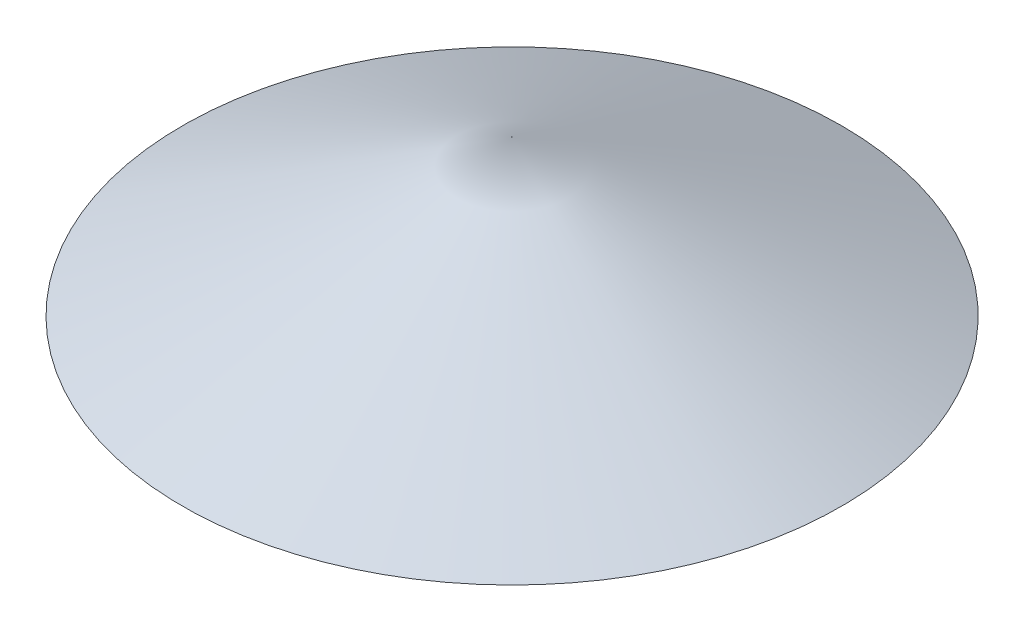
ISO-10303-21;
HEADER;
FILE_DESCRIPTION(('STEP AP214'),'2;1');
FILE_NAME('part.step','',(''),(''),'','','');
FILE_SCHEMA(('AUTOMOTIVE_DESIGN { 1 0 10303 214 1 1 1 1 }'));
ENDSEC;
DATA;
#1=APPLICATION_CONTEXT('core data for automotive mechanical design processes');
#2=APPLICATION_PROTOCOL_DEFINITION('international standard','automotive_design',2000,#1);
#3=PRODUCT_CONTEXT('',#1,'mechanical');
#4=PRODUCT('Part','Part','',(#3));
#5=PRODUCT_RELATED_PRODUCT_CATEGORY('part','',(#4));
#6=PRODUCT_DEFINITION_FORMATION('','',#4);
#7=PRODUCT_DEFINITION_CONTEXT('part definition',#1,'design');
#8=PRODUCT_DEFINITION('design','',#6,#7);
#9=PRODUCT_DEFINITION_SHAPE('','',#8);
#10=(LENGTH_UNIT() NAMED_UNIT(*) SI_UNIT(.MILLI.,.METRE.));
#11=(NAMED_UNIT(*) PLANE_ANGLE_UNIT() SI_UNIT($,.RADIAN.));
#12=(NAMED_UNIT(*) SI_UNIT($,.STERADIAN.) SOLID_ANGLE_UNIT());
#13=UNCERTAINTY_MEASURE_WITH_UNIT(LENGTH_MEASURE(1.E-05),#10,'distance_accuracy_value','');
#14=(GEOMETRIC_REPRESENTATION_CONTEXT(3) GLOBAL_UNCERTAINTY_ASSIGNED_CONTEXT((#13)) GLOBAL_UNIT_ASSIGNED_CONTEXT((#10,
#11,#12)) REPRESENTATION_CONTEXT('',''));
#15=CARTESIAN_POINT('',(0.,0.,0.));
#16=DIRECTION('',(0.,0.,1.));
#17=DIRECTION('',(1.,0.,0.));
#18=AXIS2_PLACEMENT_3D('',#15,#16,#17);
#19=CARTESIAN_POINT('',(0.,0.,0.));
#20=DIRECTION('',(0.,1.,0.));
#21=DIRECTION('',(0.,0.,1.));
#22=AXIS2_PLACEMENT_3D('',#19,#20,#21);
#23=PLANE('',#22);
#24=CARTESIAN_POINT('',(0.,0.,0.));
#25=DIRECTION('',(0.,-1.,0.));
#26=DIRECTION('',(0.,0.,-1.));
#27=AXIS2_PLACEMENT_3D('',#24,#25,#26);
#28=CIRCLE('',#27,0.85);
#29=CARTESIAN_POINT('',(0.,0.,-0.85));
#30=VERTEX_POINT('',#29);
#31=EDGE_CURVE('E11',#30,#30,#28,.T.);
#32=ORIENTED_EDGE('',*,*,#31,.T.);
#33=EDGE_LOOP('',(#32));
#34=FACE_BOUND('',#33,.T.);
#35=ADVANCED_FACE('F39',(#34),#23,.F.);
#36=CARTESIAN_POINT('',(0.,0.4,0.));
#37=DIRECTION('',(0.,-1.,0.));
#38=DIRECTION('',(0.,0.,-1.));
#39=AXIS2_PLACEMENT_3D('',#36,#37,#38);
#40=CONICAL_SURFACE('',#39,0.,1.13095374397916);
#41=ORIENTED_EDGE('',*,*,#31,.F.);
#42=EDGE_LOOP('',(#41));
#43=FACE_BOUND('',#42,.T.);
#44=CARTESIAN_POINT('',(0.,0.4,0.));
#45=VERTEX_POINT('',#44);
#46=VERTEX_LOOP('',#45);
#47=FACE_BOUND('',#46,.T.);
#48=ADVANCED_FACE('F47',(#43,#47),#40,.T.);
#49=CLOSED_SHELL('',(#35,#48));
#50=MANIFOLD_SOLID_BREP('B2',#49);
#51=ADVANCED_BREP_SHAPE_REPRESENTATION('',(#18,#50),#14);
#52=SHAPE_DEFINITION_REPRESENTATION(#9,#51);
ENDSEC;
END-ISO-10303-21;
